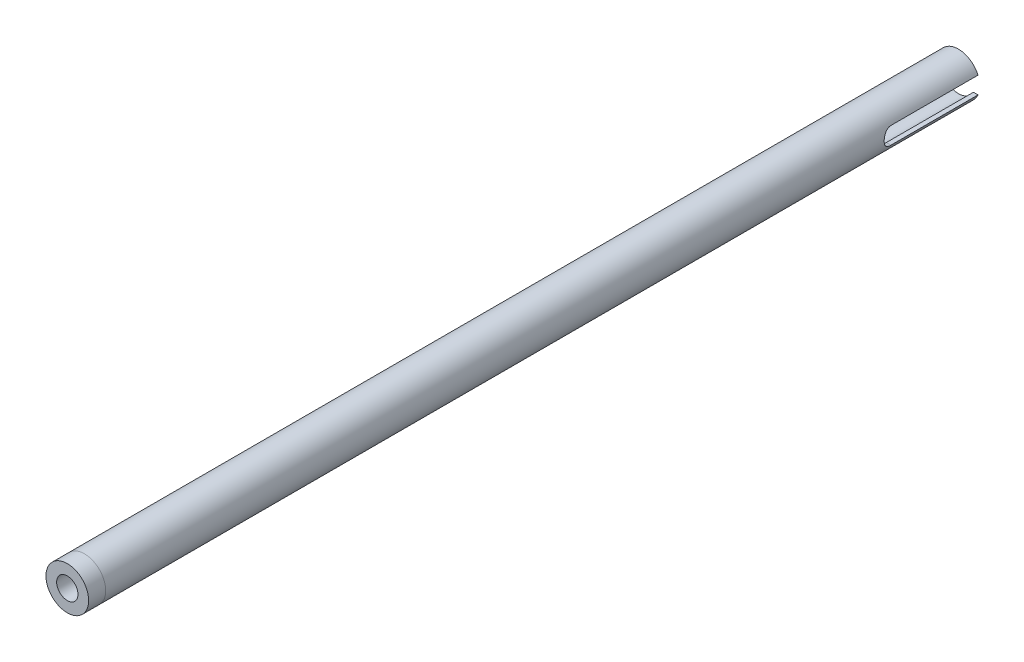
ISO-10303-21;
HEADER;
FILE_DESCRIPTION(('STEP AP214'),'2;1');
FILE_NAME('part.step','',(''),(''),'','','');
FILE_SCHEMA(('AUTOMOTIVE_DESIGN { 1 0 10303 214 1 1 1 1 }'));
ENDSEC;
DATA;
#1=APPLICATION_CONTEXT('core data for automotive mechanical design processes');
#2=APPLICATION_PROTOCOL_DEFINITION('international standard','automotive_design',2000,#1);
#3=PRODUCT_CONTEXT('',#1,'mechanical');
#4=PRODUCT('Part','Part','',(#3));
#5=PRODUCT_RELATED_PRODUCT_CATEGORY('part','',(#4));
#6=PRODUCT_DEFINITION_FORMATION('','',#4);
#7=PRODUCT_DEFINITION_CONTEXT('part definition',#1,'design');
#8=PRODUCT_DEFINITION('design','',#6,#7);
#9=PRODUCT_DEFINITION_SHAPE('','',#8);
#10=(LENGTH_UNIT() NAMED_UNIT(*) SI_UNIT(.MILLI.,.METRE.));
#11=(NAMED_UNIT(*) PLANE_ANGLE_UNIT() SI_UNIT($,.RADIAN.));
#12=(NAMED_UNIT(*) SI_UNIT($,.STERADIAN.) SOLID_ANGLE_UNIT());
#13=UNCERTAINTY_MEASURE_WITH_UNIT(LENGTH_MEASURE(1.E-05),#10,'distance_accuracy_value','');
#14=(GEOMETRIC_REPRESENTATION_CONTEXT(3) GLOBAL_UNCERTAINTY_ASSIGNED_CONTEXT((#13)) GLOBAL_UNIT_ASSIGNED_CONTEXT((#10,
#11,#12)) REPRESENTATION_CONTEXT('',''));
#15=CARTESIAN_POINT('',(0.,0.,0.));
#16=DIRECTION('',(0.,0.,1.));
#17=DIRECTION('',(1.,0.,0.));
#18=AXIS2_PLACEMENT_3D('',#15,#16,#17);
#19=CARTESIAN_POINT('',(0.,0.,-331.464013661692));
#20=DIRECTION('',(0.,0.,1.));
#21=DIRECTION('',(1.,0.,0.));
#22=AXIS2_PLACEMENT_3D('',#19,#20,#21);
#23=CYLINDRICAL_SURFACE('',#22,7.9375);
#24=CARTESIAN_POINT('',(0.,0.,-6.35));
#25=DIRECTION('',(0.,0.,1.));
#26=DIRECTION('',(1.,0.,0.));
#27=AXIS2_PLACEMENT_3D('',#24,#25,#26);
#28=CIRCLE('',#27,7.9375);
#29=CARTESIAN_POINT('',(7.9375,0.,-6.35));
#30=VERTEX_POINT('',#29);
#31=EDGE_CURVE('E167',#30,#30,#28,.T.);
#32=ORIENTED_EDGE('',*,*,#31,.F.);
#33=EDGE_LOOP('',(#32));
#34=FACE_BOUND('',#33,.T.);
#35=CARTESIAN_POINT('',(-7.2748389157424,3.175,-299.079013661692));
#36=CARTESIAN_POINT('',(-7.27482137043434,3.17501267173453,-298.99359354621));
#37=CARTESIAN_POINT('',(-7.27634297592672,3.17155313247793,-298.908183016647));
#38=CARTESIAN_POINT('',(-7.28233338484875,3.15778866907725,-298.738051012319));
#39=CARTESIAN_POINT('',(-7.28680106535325,3.14748635311323,-298.65332928746));
#40=CARTESIAN_POINT('',(-7.29852916312671,3.12019002880162,-298.485515587651));
#41=CARTESIAN_POINT('',(-7.30577831906487,3.10322299732751,-298.402418442892));
#42=CARTESIAN_POINT('',(-7.32282161153745,3.06278779397034,-298.238107340867));
#43=CARTESIAN_POINT('',(-7.33261590324725,3.03931922568674,-298.156893498753));
#44=CARTESIAN_POINT('',(-7.36535331460444,2.95952924342962,-297.917068676171));
#45=CARTESIAN_POINT('',(-7.39167595677839,2.89376893609239,-297.761943747367));
#46=CARTESIAN_POINT('',(-7.45033259991547,2.73920602658923,-297.464856320656));
#47=CARTESIAN_POINT('',(-7.48267254395243,2.65038060922872,-297.322907045438));
#48=CARTESIAN_POINT('',(-7.55175295441386,2.44684429809695,-297.048186275918));
#49=CARTESIAN_POINT('',(-7.58863404630154,2.33103943595689,-296.916258891406));
#50=CARTESIAN_POINT('',(-7.66147718953598,2.07914562663536,-296.673096007774));
#51=CARTESIAN_POINT('',(-7.69743902899202,1.94305205135848,-296.561865242847));
#52=CARTESIAN_POINT('',(-7.76611692840651,1.6477828266442,-296.358944043351));
#53=CARTESIAN_POINT('',(-7.79864638434712,1.48790317306357,-296.268209631947));
#54=CARTESIAN_POINT('',(-7.85502980346525,1.15369615984565,-296.11535207853));
#55=CARTESIAN_POINT('',(-7.87889360585224,0.979385463602728,-296.053196465912));
#56=CARTESIAN_POINT('',(-7.91022225039827,0.670405323433351,-295.972684822257));
#57=CARTESIAN_POINT('',(-7.92038443902171,0.537888188660434,-295.947006898847));
#58=CARTESIAN_POINT('',(-7.93061686811603,0.337231082382101,-295.921251815766));
#59=CARTESIAN_POINT('',(-7.93319257341971,0.269991647180293,-295.914793718485));
#60=CARTESIAN_POINT('',(-7.93663621925193,0.135173873369594,-295.906172700733));
#61=CARTESIAN_POINT('',(-7.93750363389236,0.0675954368175856,-295.904011102915));
#62=CARTESIAN_POINT('',(-7.9375,0.,-295.904013661692));
#63=B_SPLINE_CURVE_WITH_KNOTS('',3,(#35,#36,#37,#38,#39,#40,#41,#42,#43,#44,#45,#46,#47,#48,#49,
#50,#51,#52,#53,#54,#55,#56,#57,#58,#59,#60,#61,#62),.UNSPECIFIED.,.F.,.F.,(4,2,2,2,2,2,2,2,2,2,
2,2,2,4),(0.,0.256160797396612,0.512224013007114,0.767261264672295,1.02231406945471,
1.53142416248594,2.04103978047897,2.57679273649398,3.11266809162683,3.6699113602974,
4.22651992730645,4.63134321412667,4.8339937586662,5.03670667834028),.UNSPECIFIED.);
#64=CARTESIAN_POINT('',(-7.2748389157424,3.175,-299.079013661692));
#65=VERTEX_POINT('',#64);
#66=CARTESIAN_POINT('',(-7.9375,0.,-295.904013661692));
#67=VERTEX_POINT('',#66);
#68=EDGE_CURVE('E194',#65,#67,#63,.T.);
#69=ORIENTED_EDGE('',*,*,#68,.T.);
#70=CARTESIAN_POINT('',(-7.9375,0.,-295.904013661692));
#71=CARTESIAN_POINT('',(-7.93751279435796,-0.0856973243893202,-295.904001631523));
#72=CARTESIAN_POINT('',(-7.93611246860092,-0.171386675169295,-295.907482998995));
#73=CARTESIAN_POINT('',(-7.93058107051394,-0.342092796869091,-295.92133909433));
#74=CARTESIAN_POINT('',(-7.92645080745519,-0.427109759557719,-295.931711779313));
#75=CARTESIAN_POINT('',(-7.91557399086504,-0.595570690948314,-295.95920897338));
#76=CARTESIAN_POINT('',(-7.90883664469869,-0.679019123580001,-295.976309724654));
#77=CARTESIAN_POINT('',(-7.89293284658536,-0.844038966454637,-296.017076972127));
#78=CARTESIAN_POINT('',(-7.88376629739099,-0.925610301410299,-296.040743731184));
#79=CARTESIAN_POINT('',(-7.8529700783248,-1.16656173687588,-296.121251386882));
#80=CARTESIAN_POINT('',(-7.82802544143957,-1.3224472028299,-296.187644019759));
#81=CARTESIAN_POINT('',(-7.77174407779742,-1.62081902572889,-296.343689423752));
#82=CARTESIAN_POINT('',(-7.74040257287306,-1.76329524966531,-296.433359595815));
#83=CARTESIAN_POINT('',(-7.67287736621953,-2.03755465224644,-296.637813203331));
#84=CARTESIAN_POINT('',(-7.63654472176442,-2.16862853615059,-296.753500060062));
#85=CARTESIAN_POINT('',(-7.56380976030912,-2.4101102261282,-297.004794161771));
#86=CARTESIAN_POINT('',(-7.52740741976911,-2.52050895891189,-297.140410106254));
#87=CARTESIAN_POINT('',(-7.45683282624283,-2.72240939900243,-297.43510860112));
#88=CARTESIAN_POINT('',(-7.4228346735038,-2.81283701743191,-297.594972591035));
#89=CARTESIAN_POINT('',(-7.36333622196319,-2.96511894168389,-297.929098555832));
#90=CARTESIAN_POINT('',(-7.33782422493328,-3.02701262758154,-298.103340293591));
#91=CARTESIAN_POINT('',(-7.30424985403508,-3.10695047193342,-298.411644018242));
#92=CARTESIAN_POINT('',(-7.29331360019113,-3.13238569878909,-298.543502779128));
#93=CARTESIAN_POINT('',(-7.28227977674291,-3.15790858319001,-298.743219660822));
#94=CARTESIAN_POINT('',(-7.27949685702346,-3.16431127275807,-298.810167951582));
#95=CARTESIAN_POINT('',(-7.27577355567174,-3.17285909036155,-298.944409509448));
#96=CARTESIAN_POINT('',(-7.27483380475762,-3.1750027609968,-299.011702886746));
#97=CARTESIAN_POINT('',(-7.2748389157424,-3.175,-299.079013661692));
#98=B_SPLINE_CURVE_WITH_KNOTS('',3,(#70,#71,#72,#73,#74,#75,#76,#77,#78,#79,#80,#81,#82,#83,#84,
#85,#86,#87,#88,#89,#90,#91,#92,#93,#94,#95,#96,#97),.UNSPECIFIED.,.F.,.F.,(4,2,2,2,2,2,2,2,2,2,
2,2,2,4),(0.,0.256996432008012,0.513916713336978,0.769937797705373,1.02596913282157,
1.53722547809955,2.04886511530059,2.58219314099272,3.11575467201799,3.67332953074268,
4.2301325519037,4.63306130520182,4.83485003827446,5.03670780985613),.UNSPECIFIED.);
#99=CARTESIAN_POINT('',(-7.2748389157424,-3.175,-299.079013661692));
#100=VERTEX_POINT('',#99);
#101=EDGE_CURVE('E146',#67,#100,#98,.T.);
#102=ORIENTED_EDGE('',*,*,#101,.T.);
#103=DIRECTION('',(0.,0.,-1.));
#104=VECTOR('',#103,1.);
#105=CARTESIAN_POINT('',(-7.2748389157424,-3.175,-295.904013661692));
#106=LINE('',#105,#104);
#107=CARTESIAN_POINT('',(-7.2748389157424,-3.175,-331.464013661692));
#108=VERTEX_POINT('',#107);
#109=EDGE_CURVE('E141',#100,#108,#106,.T.);
#110=ORIENTED_EDGE('',*,*,#109,.T.);
#111=CARTESIAN_POINT('',(0.,0.,-331.464013661692));
#112=DIRECTION('',(0.,0.,1.));
#113=DIRECTION('',(1.,0.,0.));
#114=AXIS2_PLACEMENT_3D('',#111,#112,#113);
#115=CIRCLE('',#114,7.9375);
#116=CARTESIAN_POINT('',(7.2748389157424,-3.175,-331.464013661692));
#117=VERTEX_POINT('',#116);
#118=EDGE_CURVE('E144',#108,#117,#115,.T.);
#119=ORIENTED_EDGE('',*,*,#118,.T.);
#120=DIRECTION('',(0.,0.,-1.));
#121=VECTOR('',#120,1.);
#122=CARTESIAN_POINT('',(7.2748389157424,-3.175,-295.904013661692));
#123=LINE('',#122,#121);
#124=CARTESIAN_POINT('',(7.2748389157424,-3.175,-299.079013661692));
#125=VERTEX_POINT('',#124);
#126=EDGE_CURVE('E427',#125,#117,#123,.T.);
#127=ORIENTED_EDGE('',*,*,#126,.F.);
#128=CARTESIAN_POINT('',(7.2748389157424,-3.175,-299.079013661692));
#129=CARTESIAN_POINT('',(7.27482137043434,-3.17501267173453,-298.99359354621));
#130=CARTESIAN_POINT('',(7.27634297592672,-3.17155313247793,-298.908183016647));
#131=CARTESIAN_POINT('',(7.28233338484875,-3.15778866907725,-298.738051012319));
#132=CARTESIAN_POINT('',(7.28680106535325,-3.14748635311323,-298.65332928746));
#133=CARTESIAN_POINT('',(7.29852916312671,-3.12019002880162,-298.485515587651));
#134=CARTESIAN_POINT('',(7.30577831906487,-3.10322299732751,-298.402418442892));
#135=CARTESIAN_POINT('',(7.32282161153745,-3.06278779397034,-298.238107340867));
#136=CARTESIAN_POINT('',(7.33261590324725,-3.03931922568674,-298.156893498753));
#137=CARTESIAN_POINT('',(7.36535331460444,-2.95952924342962,-297.917068676171));
#138=CARTESIAN_POINT('',(7.39167595677839,-2.89376893609239,-297.761943747367));
#139=CARTESIAN_POINT('',(7.45033259991547,-2.73920602658923,-297.464856320656));
#140=CARTESIAN_POINT('',(7.48267254395243,-2.65038060922872,-297.322907045438));
#141=CARTESIAN_POINT('',(7.55175295441386,-2.44684429809695,-297.048186275918));
#142=CARTESIAN_POINT('',(7.58863404630154,-2.33103943595689,-296.916258891406));
#143=CARTESIAN_POINT('',(7.66147718953598,-2.07914562663536,-296.673096007774));
#144=CARTESIAN_POINT('',(7.69743902899202,-1.94305205135848,-296.561865242847));
#145=CARTESIAN_POINT('',(7.76611692840651,-1.6477828266442,-296.358944043351));
#146=CARTESIAN_POINT('',(7.79864638434712,-1.48790317306357,-296.268209631947));
#147=CARTESIAN_POINT('',(7.85502980346525,-1.15369615984565,-296.11535207853));
#148=CARTESIAN_POINT('',(7.87889360585224,-0.979385463602728,-296.053196465912));
#149=CARTESIAN_POINT('',(7.91022225039827,-0.670405323433351,-295.972684822257));
#150=CARTESIAN_POINT('',(7.92038443902171,-0.537888188660434,-295.947006898847));
#151=CARTESIAN_POINT('',(7.93061686811603,-0.337231082382101,-295.921251815766));
#152=CARTESIAN_POINT('',(7.93319257341971,-0.269991647180293,-295.914793718485));
#153=CARTESIAN_POINT('',(7.93663621925193,-0.135173873369594,-295.906172700733));
#154=CARTESIAN_POINT('',(7.93750363389236,-0.0675954368175856,-295.904011102915));
#155=CARTESIAN_POINT('',(7.9375,0.,-295.904013661692));
#156=B_SPLINE_CURVE_WITH_KNOTS('',3,(#128,#129,#130,#131,#132,#133,#134,#135,#136,#137,#138,
#139,#140,#141,#142,#143,#144,#145,#146,#147,#148,#149,#150,#151,#152,#153,#154,#155),
.UNSPECIFIED.,.F.,.F.,(4,2,2,2,2,2,2,2,2,2,2,2,2,4),(0.,0.256160797396612,0.512224013007114,
0.767261264672295,1.02231406945471,1.53142416248594,2.04103978047897,2.57679273649398,
3.11266809162683,3.6699113602974,4.22651992730645,4.63134321412667,4.8339937586662,
5.03670667834028),.UNSPECIFIED.);
#157=CARTESIAN_POINT('',(7.9375,0.,-295.904013661692));
#158=VERTEX_POINT('',#157);
#159=EDGE_CURVE('E87',#125,#158,#156,.T.);
#160=ORIENTED_EDGE('',*,*,#159,.T.);
#161=CARTESIAN_POINT('',(7.9375,0.,-295.904013661692));
#162=CARTESIAN_POINT('',(7.93751279435796,0.0856973243893202,-295.904001631523));
#163=CARTESIAN_POINT('',(7.93611246860092,0.171386675169295,-295.907482998995));
#164=CARTESIAN_POINT('',(7.93058107051394,0.342092796869091,-295.92133909433));
#165=CARTESIAN_POINT('',(7.92645080745519,0.427109759557719,-295.931711779313));
#166=CARTESIAN_POINT('',(7.91557399086504,0.595570690948314,-295.95920897338));
#167=CARTESIAN_POINT('',(7.90883664469869,0.679019123580001,-295.976309724654));
#168=CARTESIAN_POINT('',(7.89293284658536,0.844038966454637,-296.017076972127));
#169=CARTESIAN_POINT('',(7.88376629739099,0.925610301410299,-296.040743731184));
#170=CARTESIAN_POINT('',(7.8529700783248,1.16656173687588,-296.121251386882));
#171=CARTESIAN_POINT('',(7.82802544143957,1.3224472028299,-296.187644019759));
#172=CARTESIAN_POINT('',(7.77174407779742,1.62081902572889,-296.343689423752));
#173=CARTESIAN_POINT('',(7.74040257287306,1.76329524966531,-296.433359595815));
#174=CARTESIAN_POINT('',(7.67287736621953,2.03755465224644,-296.637813203331));
#175=CARTESIAN_POINT('',(7.63654472176442,2.16862853615059,-296.753500060062));
#176=CARTESIAN_POINT('',(7.56380976030912,2.4101102261282,-297.004794161771));
#177=CARTESIAN_POINT('',(7.52740741976911,2.52050895891189,-297.140410106254));
#178=CARTESIAN_POINT('',(7.45683282624283,2.72240939900243,-297.43510860112));
#179=CARTESIAN_POINT('',(7.4228346735038,2.81283701743191,-297.594972591035));
#180=CARTESIAN_POINT('',(7.36333622196319,2.96511894168389,-297.929098555832));
#181=CARTESIAN_POINT('',(7.33782422493328,3.02701262758154,-298.103340293591));
#182=CARTESIAN_POINT('',(7.30424985403508,3.10695047193342,-298.411644018242));
#183=CARTESIAN_POINT('',(7.29331360019113,3.13238569878909,-298.543502779128));
#184=CARTESIAN_POINT('',(7.28227977674291,3.15790858319001,-298.743219660822));
#185=CARTESIAN_POINT('',(7.27949685702346,3.16431127275807,-298.810167951582));
#186=CARTESIAN_POINT('',(7.27577355567174,3.17285909036155,-298.944409509448));
#187=CARTESIAN_POINT('',(7.27483380475762,3.1750027609968,-299.011702886746));
#188=CARTESIAN_POINT('',(7.2748389157424,3.175,-299.079013661692));
#189=B_SPLINE_CURVE_WITH_KNOTS('',3,(#161,#162,#163,#164,#165,#166,#167,#168,#169,#170,#171,
#172,#173,#174,#175,#176,#177,#178,#179,#180,#181,#182,#183,#184,#185,#186,#187,#188),
.UNSPECIFIED.,.F.,.F.,(4,2,2,2,2,2,2,2,2,2,2,2,2,4),(0.,0.256996432008012,0.513916713336978,
0.769937797705373,1.02596913282157,1.53722547809955,2.04886511530059,2.58219314099272,
3.11575467201799,3.67332953074268,4.2301325519037,4.63306130520182,4.83485003827446,
5.03670780985613),.UNSPECIFIED.);
#190=CARTESIAN_POINT('',(7.2748389157424,3.175,-299.079013661692));
#191=VERTEX_POINT('',#190);
#192=EDGE_CURVE('E73',#158,#191,#189,.T.);
#193=ORIENTED_EDGE('',*,*,#192,.T.);
#194=DIRECTION('',(0.,0.,-1.));
#195=VECTOR('',#194,1.);
#196=CARTESIAN_POINT('',(7.2748389157424,3.175,-295.904013661692));
#197=LINE('',#196,#195);
#198=CARTESIAN_POINT('',(7.2748389157424,3.175,-331.464013661692));
#199=VERTEX_POINT('',#198);
#200=EDGE_CURVE('E160',#191,#199,#197,.T.);
#201=ORIENTED_EDGE('',*,*,#200,.T.);
#202=CARTESIAN_POINT('',(-7.2748389157424,3.175,-331.464013661692));
#203=VERTEX_POINT('',#202);
#204=EDGE_CURVE('E166',#199,#203,#115,.T.);
#205=ORIENTED_EDGE('',*,*,#204,.T.);
#206=DIRECTION('',(0.,0.,-1.));
#207=VECTOR('',#206,1.);
#208=CARTESIAN_POINT('',(-7.2748389157424,3.175,-295.904013661692));
#209=LINE('',#208,#207);
#210=EDGE_CURVE('E420',#65,#203,#209,.T.);
#211=ORIENTED_EDGE('',*,*,#210,.F.);
#212=EDGE_LOOP('',(#69,#102,#110,#119,#127,#160,#193,#201,#205,#211));
#213=FACE_BOUND('',#212,.T.);
#214=ADVANCED_FACE('F63',(#34,#213),#23,.T.);
#215=CARTESIAN_POINT('',(0.,0.,-331.464013661692));
#216=DIRECTION('',(0.,0.,1.));
#217=DIRECTION('',(1.,0.,0.));
#218=AXIS2_PLACEMENT_3D('',#215,#216,#217);
#219=PLANE('',#218);
#220=DIRECTION('',(1.,0.,0.));
#221=VECTOR('',#220,1.);
#222=CARTESIAN_POINT('',(0.,-3.175,-331.464013661692));
#223=LINE('',#222,#221);
#224=CARTESIAN_POINT('',(-5.57246419907746,-3.175,-331.464013661692));
#225=VERTEX_POINT('',#224);
#226=EDGE_CURVE('E153',#108,#225,#223,.T.);
#227=ORIENTED_EDGE('',*,*,#226,.T.);
#228=CARTESIAN_POINT('',(0.,0.,-331.464013661692));
#229=DIRECTION('',(0.,0.,1.));
#230=DIRECTION('',(1.,0.,0.));
#231=AXIS2_PLACEMENT_3D('',#228,#229,#230);
#232=CIRCLE('',#231,6.4135);
#233=CARTESIAN_POINT('',(5.57246419907746,-3.175,-331.464013661692));
#234=VERTEX_POINT('',#233);
#235=EDGE_CURVE('E275',#225,#234,#232,.T.);
#236=ORIENTED_EDGE('',*,*,#235,.T.);
#237=DIRECTION('',(1.,0.,0.));
#238=VECTOR('',#237,1.);
#239=CARTESIAN_POINT('',(0.,-3.175,-331.464013661692));
#240=LINE('',#239,#238);
#241=EDGE_CURVE('E165',#234,#117,#240,.T.);
#242=ORIENTED_EDGE('',*,*,#241,.T.);
#243=ORIENTED_EDGE('',*,*,#118,.F.);
#244=EDGE_LOOP('',(#227,#236,#242,#243));
#245=FACE_BOUND('',#244,.T.);
#246=ADVANCED_FACE('F163',(#245),#219,.F.);
#247=CARTESIAN_POINT('',(0.,0.,-331.464013661692));
#248=DIRECTION('',(0.,0.,1.));
#249=DIRECTION('',(1.,0.,0.));
#250=AXIS2_PLACEMENT_3D('',#247,#248,#249);
#251=CYLINDRICAL_SURFACE('',#250,6.4135);
#252=CARTESIAN_POINT('',(0.,0.,-6.35));
#253=DIRECTION('',(0.,0.,1.));
#254=DIRECTION('',(1.,0.,0.));
#255=AXIS2_PLACEMENT_3D('',#252,#253,#254);
#256=CIRCLE('',#255,6.4135);
#257=CARTESIAN_POINT('',(6.4135,0.,-6.35));
#258=VERTEX_POINT('',#257);
#259=EDGE_CURVE('E149',#258,#258,#256,.T.);
#260=ORIENTED_EDGE('',*,*,#259,.T.);
#261=EDGE_LOOP('',(#260));
#262=FACE_BOUND('',#261,.T.);
#263=DIRECTION('',(0.,0.,-1.));
#264=VECTOR('',#263,1.);
#265=CARTESIAN_POINT('',(-5.57246419907746,-3.175,-295.904013661692));
#266=LINE('',#265,#264);
#267=CARTESIAN_POINT('',(-5.57246419907746,-3.175,-299.079013661692));
#268=VERTEX_POINT('',#267);
#269=EDGE_CURVE('E150',#268,#225,#266,.T.);
#270=ORIENTED_EDGE('',*,*,#269,.F.);
#271=CARTESIAN_POINT('',(-5.57246419907746,-3.175,-299.079013661692));
#272=CARTESIAN_POINT('',(-5.57244013006406,-3.17501485930532,-298.995734548654));
#273=CARTESIAN_POINT('',(-5.57433046393327,-3.17172393593588,-298.912468781783));
#274=CARTESIAN_POINT('',(-5.58175879139227,-3.1586474174694,-298.746661196971));
#275=CARTESIAN_POINT('',(-5.58729459414878,-3.14886572313218,-298.66411897437));
#276=CARTESIAN_POINT('',(-5.60179156831921,-3.12299843383606,-298.500822167641));
#277=CARTESIAN_POINT('',(-5.61073298145,-3.10694918790096,-298.420060062727));
#278=CARTESIAN_POINT('',(-5.63171276239417,-3.06875665913499,-298.260416147227));
#279=CARTESIAN_POINT('',(-5.64375147558632,-3.04661269666535,-298.181534547406));
#280=CARTESIAN_POINT('',(-5.6838799338154,-2.97148657354665,-297.948801372408));
#281=CARTESIAN_POINT('',(-5.71602843451585,-2.9097324304215,-297.798380875169));
#282=CARTESIAN_POINT('',(-5.78746445334562,-2.76491119647659,-297.509923658341));
#283=CARTESIAN_POINT('',(-5.82676307252431,-2.68181088046088,-297.371906700975));
#284=CARTESIAN_POINT('',(-5.91189137020974,-2.48887418737119,-297.100109616947));
#285=CARTESIAN_POINT('',(-5.95799203211626,-2.37743022169017,-296.967552814495));
#286=CARTESIAN_POINT('',(-6.04933625068998,-2.1343317962695,-296.722085145423));
#287=CARTESIAN_POINT('',(-6.09457954365871,-2.00267122837298,-296.60918023841));
#288=CARTESIAN_POINT('',(-6.18270630442022,-1.71220053093684,-296.398860945958));
#289=CARTESIAN_POINT('',(-6.22523407848511,-1.55216870534977,-296.302971195526));
#290=CARTESIAN_POINT('',(-6.29953728626817,-1.21586879246633,-296.140122299209));
#291=CARTESIAN_POINT('',(-6.33132906884324,-1.03962591706377,-296.073119121166));
#292=CARTESIAN_POINT('',(-6.37455801221378,-0.719418942476251,-295.983247288836));
#293=CARTESIAN_POINT('',(-6.38903678436651,-0.577736145507957,-295.953674574471));
#294=CARTESIAN_POINT('',(-6.40364692368403,-0.362616983152035,-295.923953500157));
#295=CARTESIAN_POINT('',(-6.40733246196224,-0.290370591494077,-295.916485987519));
#296=CARTESIAN_POINT('',(-6.41226237468065,-0.145424356491906,-295.906513098581));
#297=CARTESIAN_POINT('',(-6.41350576158006,-0.072724341630371,-295.904009729644));
#298=CARTESIAN_POINT('',(-6.4135,0.,-295.904013661692));
#299=B_SPLINE_CURVE_WITH_KNOTS('',3,(#271,#272,#273,#274,#275,#276,#277,#278,#279,#280,#281,
#282,#283,#284,#285,#286,#287,#288,#289,#290,#291,#292,#293,#294,#295,#296,#297,#298),
.UNSPECIFIED.,.F.,.F.,(4,2,2,2,2,2,2,2,2,2,2,2,2,4),(0.,0.249729002226553,0.499308060527526,
0.747460667546715,0.995640957972498,1.49055300136661,1.98624009021394,2.52160227908796,
3.05712653941521,3.62817923327589,4.19835836008502,4.63305000595099,4.85103401853339,
5.06910615989469),.UNSPECIFIED.);
#300=CARTESIAN_POINT('',(-6.4135,0.,-295.904013661692));
#301=VERTEX_POINT('',#300);
#302=EDGE_CURVE('E221',#268,#301,#299,.T.);
#303=ORIENTED_EDGE('',*,*,#302,.T.);
#304=CARTESIAN_POINT('',(-6.4135,0.,-295.904013661692));
#305=CARTESIAN_POINT('',(-6.41351478956106,0.0839162873638173,-295.904000261796));
#306=CARTESIAN_POINT('',(-6.41185341043851,0.167823114288178,-295.907340187843));
#307=CARTESIAN_POINT('',(-6.40528923860734,0.334952536326365,-295.920622628448));
#308=CARTESIAN_POINT('',(-6.40038773102953,0.41817538948009,-295.930562525269));
#309=CARTESIAN_POINT('',(-6.38748331817869,0.582965498785221,-295.956881329787));
#310=CARTESIAN_POINT('',(-6.37949454331383,0.664538541389254,-295.973230905275));
#311=CARTESIAN_POINT('',(-6.36062930478242,0.82582159525237,-296.012169208868));
#312=CARTESIAN_POINT('',(-6.34975266552956,0.905531492908813,-296.034758316349));
#313=CARTESIAN_POINT('',(-6.31319792977547,1.14087800407252,-296.111494879109));
#314=CARTESIAN_POINT('',(-6.28356695572383,1.29306927815055,-296.174666527297));
#315=CARTESIAN_POINT('',(-6.21648032622801,1.58455945770354,-296.322817269277));
#316=CARTESIAN_POINT('',(-6.17901685649498,1.72384528592309,-296.407818161057));
#317=CARTESIAN_POINT('',(-6.09713913910647,1.99475482128857,-296.602918299308));
#318=CARTESIAN_POINT('',(-6.05244508581476,2.12544046453043,-296.714203176046));
#319=CARTESIAN_POINT('',(-5.96206469267669,2.36716277188881,-296.956172622211));
#320=CARTESIAN_POINT('',(-5.9163776032387,2.47818397002904,-297.086872314051));
#321=CARTESIAN_POINT('',(-5.82517699615972,2.68591268931947,-297.375918143003));
#322=CARTESIAN_POINT('',(-5.77994318763785,2.78087960507693,-297.535613337583));
#323=CARTESIAN_POINT('',(-5.69959190124919,2.94207442790849,-297.870996614765));
#324=CARTESIAN_POINT('',(-5.66445328320705,3.00836254036259,-298.046650247937));
#325=CARTESIAN_POINT('',(-5.61637168534322,3.09697219420916,-298.36510162233));
#326=CARTESIAN_POINT('',(-5.60011055849822,3.12606223436071,-298.50551622499));
#327=CARTESIAN_POINT('',(-5.58363385282995,3.15533369889113,-298.718893103233));
#328=CARTESIAN_POINT('',(-5.57946041232981,3.16269716900746,-298.790624828114));
#329=CARTESIAN_POINT('',(-5.57386984218861,3.17253394278506,-298.934566768157));
#330=CARTESIAN_POINT('',(-5.57245416126573,3.17500467618403,-299.006777214828));
#331=CARTESIAN_POINT('',(-5.57246419907746,3.175,-299.079013661692));
#332=B_SPLINE_CURVE_WITH_KNOTS('',3,(#304,#305,#306,#307,#308,#309,#310,#311,#312,#313,#314,
#315,#316,#317,#318,#319,#320,#321,#322,#323,#324,#325,#326,#327,#328,#329,#330,#331),
.UNSPECIFIED.,.F.,.F.,(4,2,2,2,2,2,2,2,2,2,2,2,2,4),(0.,0.251650249697321,0.503200747298848,
0.753613280993143,1.00404104361821,1.50387930503277,2.00421864304452,2.53410176460236,
3.06439980342595,3.63519589642623,4.20478783377489,4.63602373673199,4.85251353275909,
5.06911702550462),.UNSPECIFIED.);
#333=CARTESIAN_POINT('',(-5.57246419907746,3.175,-299.079013661692));
#334=VERTEX_POINT('',#333);
#335=EDGE_CURVE('E186',#301,#334,#332,.T.);
#336=ORIENTED_EDGE('',*,*,#335,.T.);
#337=DIRECTION('',(0.,0.,-1.));
#338=VECTOR('',#337,1.);
#339=CARTESIAN_POINT('',(-5.57246419907746,3.175,-295.904013661692));
#340=LINE('',#339,#338);
#341=CARTESIAN_POINT('',(-5.57246419907746,3.175,-331.464013661692));
#342=VERTEX_POINT('',#341);
#343=EDGE_CURVE('E417',#334,#342,#340,.T.);
#344=ORIENTED_EDGE('',*,*,#343,.T.);
#345=CARTESIAN_POINT('',(5.57246419907746,3.175,-331.464013661692));
#346=VERTEX_POINT('',#345);
#347=EDGE_CURVE('E172',#346,#342,#232,.T.);
#348=ORIENTED_EDGE('',*,*,#347,.F.);
#349=DIRECTION('',(0.,0.,-1.));
#350=VECTOR('',#349,1.);
#351=CARTESIAN_POINT('',(5.57246419907746,3.175,-295.904013661692));
#352=LINE('',#351,#350);
#353=CARTESIAN_POINT('',(5.57246419907746,3.175,-299.079013661692));
#354=VERTEX_POINT('',#353);
#355=EDGE_CURVE('E269',#354,#346,#352,.T.);
#356=ORIENTED_EDGE('',*,*,#355,.F.);
#357=CARTESIAN_POINT('',(5.57246419907746,3.175,-299.079013661692));
#358=CARTESIAN_POINT('',(5.57244013006406,3.17501485930532,-298.995734548654));
#359=CARTESIAN_POINT('',(5.57433046393327,3.17172393593588,-298.912468781783));
#360=CARTESIAN_POINT('',(5.58175879139227,3.1586474174694,-298.746661196971));
#361=CARTESIAN_POINT('',(5.58729459414878,3.14886572313218,-298.66411897437));
#362=CARTESIAN_POINT('',(5.60179156831921,3.12299843383606,-298.500822167641));
#363=CARTESIAN_POINT('',(5.61073298145,3.10694918790096,-298.420060062727));
#364=CARTESIAN_POINT('',(5.63171276239417,3.06875665913499,-298.260416147227));
#365=CARTESIAN_POINT('',(5.64375147558632,3.04661269666535,-298.181534547406));
#366=CARTESIAN_POINT('',(5.6838799338154,2.97148657354665,-297.948801372408));
#367=CARTESIAN_POINT('',(5.71602843451585,2.9097324304215,-297.798380875169));
#368=CARTESIAN_POINT('',(5.78746445334562,2.76491119647659,-297.509923658341));
#369=CARTESIAN_POINT('',(5.82676307252431,2.68181088046088,-297.371906700975));
#370=CARTESIAN_POINT('',(5.91189137020974,2.48887418737119,-297.100109616947));
#371=CARTESIAN_POINT('',(5.95799203211626,2.37743022169017,-296.967552814495));
#372=CARTESIAN_POINT('',(6.04933625068998,2.1343317962695,-296.722085145423));
#373=CARTESIAN_POINT('',(6.09457954365871,2.00267122837298,-296.60918023841));
#374=CARTESIAN_POINT('',(6.18270630442022,1.71220053093684,-296.398860945958));
#375=CARTESIAN_POINT('',(6.22523407848511,1.55216870534977,-296.302971195526));
#376=CARTESIAN_POINT('',(6.29953728626817,1.21586879246633,-296.140122299209));
#377=CARTESIAN_POINT('',(6.33132906884324,1.03962591706377,-296.073119121166));
#378=CARTESIAN_POINT('',(6.37455801221378,0.719418942476251,-295.983247288836));
#379=CARTESIAN_POINT('',(6.38903678436651,0.577736145507957,-295.953674574471));
#380=CARTESIAN_POINT('',(6.40364692368403,0.362616983152035,-295.923953500157));
#381=CARTESIAN_POINT('',(6.40733246196224,0.290370591494077,-295.916485987519));
#382=CARTESIAN_POINT('',(6.41226237468065,0.145424356491906,-295.906513098581));
#383=CARTESIAN_POINT('',(6.41350576158006,0.072724341630371,-295.904009729644));
#384=CARTESIAN_POINT('',(6.4135,0.,-295.904013661692));
#385=B_SPLINE_CURVE_WITH_KNOTS('',3,(#357,#358,#359,#360,#361,#362,#363,#364,#365,#366,#367,
#368,#369,#370,#371,#372,#373,#374,#375,#376,#377,#378,#379,#380,#381,#382,#383,#384),
.UNSPECIFIED.,.F.,.F.,(4,2,2,2,2,2,2,2,2,2,2,2,2,4),(0.,0.249729002226553,0.499308060527526,
0.747460667546715,0.995640957972498,1.49055300136661,1.98624009021394,2.52160227908796,
3.05712653941521,3.62817923327589,4.19835836008502,4.63305000595099,4.85103401853339,
5.06910615989469),.UNSPECIFIED.);
#386=CARTESIAN_POINT('',(6.4135,0.,-295.904013661692));
#387=VERTEX_POINT('',#386);
#388=EDGE_CURVE('E13',#354,#387,#385,.T.);
#389=ORIENTED_EDGE('',*,*,#388,.T.);
#390=CARTESIAN_POINT('',(6.4135,0.,-295.904013661692));
#391=CARTESIAN_POINT('',(6.41351478956106,-0.0839162873638173,-295.904000261796));
#392=CARTESIAN_POINT('',(6.41185341043851,-0.167823114288178,-295.907340187843));
#393=CARTESIAN_POINT('',(6.40528923860734,-0.334952536326365,-295.920622628448));
#394=CARTESIAN_POINT('',(6.40038773102953,-0.41817538948009,-295.930562525269));
#395=CARTESIAN_POINT('',(6.38748331817869,-0.582965498785221,-295.956881329787));
#396=CARTESIAN_POINT('',(6.37949454331383,-0.664538541389254,-295.973230905275));
#397=CARTESIAN_POINT('',(6.36062930478242,-0.82582159525237,-296.012169208868));
#398=CARTESIAN_POINT('',(6.34975266552956,-0.905531492908813,-296.034758316349));
#399=CARTESIAN_POINT('',(6.31319792977547,-1.14087800407252,-296.111494879109));
#400=CARTESIAN_POINT('',(6.28356695572383,-1.29306927815055,-296.174666527297));
#401=CARTESIAN_POINT('',(6.21648032622801,-1.58455945770354,-296.322817269277));
#402=CARTESIAN_POINT('',(6.17901685649498,-1.72384528592309,-296.407818161057));
#403=CARTESIAN_POINT('',(6.09713913910647,-1.99475482128857,-296.602918299308));
#404=CARTESIAN_POINT('',(6.05244508581476,-2.12544046453043,-296.714203176046));
#405=CARTESIAN_POINT('',(5.96206469267669,-2.36716277188881,-296.956172622211));
#406=CARTESIAN_POINT('',(5.9163776032387,-2.47818397002904,-297.086872314051));
#407=CARTESIAN_POINT('',(5.82517699615972,-2.68591268931947,-297.375918143003));
#408=CARTESIAN_POINT('',(5.77994318763785,-2.78087960507693,-297.535613337583));
#409=CARTESIAN_POINT('',(5.69959190124919,-2.94207442790849,-297.870996614765));
#410=CARTESIAN_POINT('',(5.66445328320705,-3.00836254036259,-298.046650247937));
#411=CARTESIAN_POINT('',(5.61637168534322,-3.09697219420916,-298.36510162233));
#412=CARTESIAN_POINT('',(5.60011055849822,-3.12606223436071,-298.50551622499));
#413=CARTESIAN_POINT('',(5.58363385282995,-3.15533369889113,-298.718893103233));
#414=CARTESIAN_POINT('',(5.57946041232981,-3.16269716900746,-298.790624828114));
#415=CARTESIAN_POINT('',(5.57386984218861,-3.17253394278506,-298.934566768157));
#416=CARTESIAN_POINT('',(5.57245416126573,-3.17500467618403,-299.006777214828));
#417=CARTESIAN_POINT('',(5.57246419907746,-3.175,-299.079013661692));
#418=B_SPLINE_CURVE_WITH_KNOTS('',3,(#390,#391,#392,#393,#394,#395,#396,#397,#398,#399,#400,
#401,#402,#403,#404,#405,#406,#407,#408,#409,#410,#411,#412,#413,#414,#415,#416,#417),
.UNSPECIFIED.,.F.,.F.,(4,2,2,2,2,2,2,2,2,2,2,2,2,4),(0.,0.251650249697321,0.503200747298848,
0.753613280993143,1.00404104361821,1.50387930503277,2.00421864304452,2.53410176460236,
3.06439980342595,3.63519589642623,4.20478783377489,4.63602373673199,4.85251353275909,
5.06911702550462),.UNSPECIFIED.);
#419=CARTESIAN_POINT('',(5.57246419907746,-3.175,-299.079013661692));
#420=VERTEX_POINT('',#419);
#421=EDGE_CURVE('E237',#387,#420,#418,.T.);
#422=ORIENTED_EDGE('',*,*,#421,.T.);
#423=DIRECTION('',(0.,0.,-1.));
#424=VECTOR('',#423,1.);
#425=CARTESIAN_POINT('',(5.57246419907746,-3.175,-295.904013661692));
#426=LINE('',#425,#424);
#427=EDGE_CURVE('E271',#420,#234,#426,.T.);
#428=ORIENTED_EDGE('',*,*,#427,.T.);
#429=ORIENTED_EDGE('',*,*,#235,.F.);
#430=EDGE_LOOP('',(#270,#303,#336,#344,#348,#356,#389,#422,#428,#429));
#431=FACE_BOUND('',#430,.T.);
#432=ADVANCED_FACE('F201',(#262,#431),#251,.F.);
#433=ORIENTED_EDGE('',*,*,#347,.T.);
#434=DIRECTION('',(1.,0.,0.));
#435=VECTOR('',#434,1.);
#436=CARTESIAN_POINT('',(0.,3.175,-331.464013661692));
#437=LINE('',#436,#435);
#438=EDGE_CURVE('E159',#203,#342,#437,.T.);
#439=ORIENTED_EDGE('',*,*,#438,.F.);
#440=ORIENTED_EDGE('',*,*,#204,.F.);
#441=DIRECTION('',(1.,0.,0.));
#442=VECTOR('',#441,1.);
#443=CARTESIAN_POINT('',(0.,3.175,-331.464013661692));
#444=LINE('',#443,#442);
#445=EDGE_CURVE('E253',#346,#199,#444,.T.);
#446=ORIENTED_EDGE('',*,*,#445,.F.);
#447=EDGE_LOOP('',(#433,#439,#440,#446));
#448=FACE_BOUND('',#447,.T.);
#449=ADVANCED_FACE('F286',(#448),#219,.F.);
#450=CARTESIAN_POINT('',(0.,0.,-6.35));
#451=DIRECTION('',(0.,0.,1.));
#452=DIRECTION('',(1.,0.,0.));
#453=AXIS2_PLACEMENT_3D('',#450,#451,#452);
#454=PLANE('',#453);
#455=ORIENTED_EDGE('',*,*,#259,.F.);
#456=EDGE_LOOP('',(#455));
#457=FACE_BOUND('',#456,.T.);
#458=ORIENTED_EDGE('',*,*,#31,.T.);
#459=EDGE_LOOP('',(#458));
#460=FACE_BOUND('',#459,.T.);
#461=ADVANCED_FACE('F283',(#457,#460),#454,.T.);
#462=CARTESIAN_POINT('',(0.,3.175,-295.904013661692));
#463=DIRECTION('',(0.,1.,0.));
#464=DIRECTION('',(0.,0.,1.));
#465=AXIS2_PLACEMENT_3D('',#462,#463,#464);
#466=PLANE('',#465);
#467=ORIENTED_EDGE('',*,*,#200,.F.);
#468=DIRECTION('',(1.,0.,0.));
#469=VECTOR('',#468,1.);
#470=CARTESIAN_POINT('',(5.57246419907746,3.175,-299.079013661692));
#471=LINE('',#470,#469);
#472=EDGE_CURVE('E184',#191,#354,#471,.F.);
#473=ORIENTED_EDGE('',*,*,#472,.T.);
#474=ORIENTED_EDGE('',*,*,#355,.T.);
#475=ORIENTED_EDGE('',*,*,#445,.T.);
#476=EDGE_LOOP('',(#467,#473,#474,#475));
#477=FACE_BOUND('',#476,.T.);
#478=ADVANCED_FACE('F266',(#477),#466,.F.);
#479=CARTESIAN_POINT('',(0.,-3.175,-295.904013661692));
#480=DIRECTION('',(0.,1.,0.));
#481=DIRECTION('',(0.,0.,1.));
#482=AXIS2_PLACEMENT_3D('',#479,#480,#481);
#483=PLANE('',#482);
#484=ORIENTED_EDGE('',*,*,#427,.F.);
#485=DIRECTION('',(1.,0.,0.));
#486=VECTOR('',#485,1.);
#487=CARTESIAN_POINT('',(0.,-3.175,-299.079013661692));
#488=LINE('',#487,#486);
#489=EDGE_CURVE('E181',#420,#125,#488,.T.);
#490=ORIENTED_EDGE('',*,*,#489,.T.);
#491=ORIENTED_EDGE('',*,*,#126,.T.);
#492=ORIENTED_EDGE('',*,*,#241,.F.);
#493=EDGE_LOOP('',(#484,#490,#491,#492));
#494=FACE_BOUND('',#493,.T.);
#495=ADVANCED_FACE('F361',(#494),#483,.T.);
#496=CARTESIAN_POINT('',(0.,-3.175,-295.904013661692));
#497=DIRECTION('',(0.,1.,0.));
#498=DIRECTION('',(0.,0.,1.));
#499=AXIS2_PLACEMENT_3D('',#496,#497,#498);
#500=PLANE('',#499);
#501=ORIENTED_EDGE('',*,*,#109,.F.);
#502=DIRECTION('',(1.,0.,0.));
#503=VECTOR('',#502,1.);
#504=CARTESIAN_POINT('',(0.,-3.175,-299.079013661692));
#505=LINE('',#504,#503);
#506=EDGE_CURVE('E179',#100,#268,#505,.T.);
#507=ORIENTED_EDGE('',*,*,#506,.T.);
#508=ORIENTED_EDGE('',*,*,#269,.T.);
#509=ORIENTED_EDGE('',*,*,#226,.F.);
#510=EDGE_LOOP('',(#501,#507,#508,#509));
#511=FACE_BOUND('',#510,.T.);
#512=ADVANCED_FACE('F154',(#511),#500,.T.);
#513=CARTESIAN_POINT('',(0.,3.175,-295.904013661692));
#514=DIRECTION('',(0.,1.,0.));
#515=DIRECTION('',(0.,0.,1.));
#516=AXIS2_PLACEMENT_3D('',#513,#514,#515);
#517=PLANE('',#516);
#518=ORIENTED_EDGE('',*,*,#343,.F.);
#519=DIRECTION('',(1.,0.,0.));
#520=VECTOR('',#519,1.);
#521=CARTESIAN_POINT('',(-7.2748389157424,3.175,-299.079013661692));
#522=LINE('',#521,#520);
#523=EDGE_CURVE('E170',#334,#65,#522,.F.);
#524=ORIENTED_EDGE('',*,*,#523,.T.);
#525=ORIENTED_EDGE('',*,*,#210,.T.);
#526=ORIENTED_EDGE('',*,*,#438,.T.);
#527=EDGE_LOOP('',(#518,#524,#525,#526));
#528=FACE_BOUND('',#527,.T.);
#529=ADVANCED_FACE('F216',(#528),#517,.F.);
#530=CARTESIAN_POINT('',(0.,0.,-299.079013661692));
#531=DIRECTION('',(1.,0.,0.));
#532=DIRECTION('',(0.,0.,-1.));
#533=AXIS2_PLACEMENT_3D('',#530,#531,#532);
#534=CYLINDRICAL_SURFACE('',#533,3.175);
#535=ORIENTED_EDGE('',*,*,#506,.F.);
#536=ORIENTED_EDGE('',*,*,#101,.F.);
#537=DIRECTION('',(1.,0.,0.));
#538=VECTOR('',#537,1.);
#539=CARTESIAN_POINT('',(0.,0.,-295.904013661692));
#540=LINE('',#539,#538);
#541=EDGE_CURVE('E251',#301,#67,#540,.F.);
#542=ORIENTED_EDGE('',*,*,#541,.F.);
#543=ORIENTED_EDGE('',*,*,#302,.F.);
#544=EDGE_LOOP('',(#535,#536,#542,#543));
#545=FACE_BOUND('',#544,.T.);
#546=ADVANCED_FACE('F209',(#545),#534,.F.);
#547=CARTESIAN_POINT('',(0.,0.,-299.079013661692));
#548=DIRECTION('',(-1.,0.,0.));
#549=DIRECTION('',(0.,0.,1.));
#550=AXIS2_PLACEMENT_3D('',#547,#548,#549);
#551=CYLINDRICAL_SURFACE('',#550,3.175);
#552=ORIENTED_EDGE('',*,*,#68,.F.);
#553=ORIENTED_EDGE('',*,*,#523,.F.);
#554=ORIENTED_EDGE('',*,*,#335,.F.);
#555=ORIENTED_EDGE('',*,*,#541,.T.);
#556=EDGE_LOOP('',(#552,#553,#554,#555));
#557=FACE_BOUND('',#556,.T.);
#558=ADVANCED_FACE('F205',(#557),#551,.F.);
#559=CARTESIAN_POINT('',(0.,0.,-299.079013661692));
#560=DIRECTION('',(-1.,0.,0.));
#561=DIRECTION('',(0.,0.,1.));
#562=AXIS2_PLACEMENT_3D('',#559,#560,#561);
#563=CYLINDRICAL_SURFACE('',#562,3.175);
#564=DIRECTION('',(1.,0.,0.));
#565=VECTOR('',#564,1.);
#566=CARTESIAN_POINT('',(7.2748389157424,0.,-295.904013661692));
#567=LINE('',#566,#565);
#568=EDGE_CURVE('E68',#387,#158,#567,.T.);
#569=ORIENTED_EDGE('',*,*,#568,.F.);
#570=ORIENTED_EDGE('',*,*,#388,.F.);
#571=ORIENTED_EDGE('',*,*,#472,.F.);
#572=ORIENTED_EDGE('',*,*,#192,.F.);
#573=EDGE_LOOP('',(#569,#570,#571,#572));
#574=FACE_BOUND('',#573,.T.);
#575=ADVANCED_FACE('F65',(#574),#563,.F.);
#576=CARTESIAN_POINT('',(0.,0.,-299.079013661692));
#577=DIRECTION('',(1.,0.,0.));
#578=DIRECTION('',(0.,0.,-1.));
#579=AXIS2_PLACEMENT_3D('',#576,#577,#578);
#580=CYLINDRICAL_SURFACE('',#579,3.175);
#581=ORIENTED_EDGE('',*,*,#421,.F.);
#582=ORIENTED_EDGE('',*,*,#568,.T.);
#583=ORIENTED_EDGE('',*,*,#159,.F.);
#584=ORIENTED_EDGE('',*,*,#489,.F.);
#585=EDGE_LOOP('',(#581,#582,#583,#584));
#586=FACE_BOUND('',#585,.T.);
#587=ADVANCED_FACE('F218',(#586),#580,.F.);
#588=CLOSED_SHELL('',(#214,#246,#432,#449,#461,#478,#495,#512,#529,#546,#558,#575,#587));
#589=MANIFOLD_SOLID_BREP('B2',#588);
#590=CARTESIAN_POINT('',(0.,0.,-6.35));
#591=DIRECTION('',(0.,0.,1.));
#592=DIRECTION('',(1.,0.,0.));
#593=AXIS2_PLACEMENT_3D('',#590,#591,#592);
#594=CYLINDRICAL_SURFACE('',#593,7.9375);
#595=CARTESIAN_POINT('',(0.,0.,-6.35));
#596=DIRECTION('',(0.,0.,1.));
#597=DIRECTION('',(1.,0.,0.));
#598=AXIS2_PLACEMENT_3D('',#595,#596,#597);
#599=CIRCLE('',#598,7.9375);
#600=CARTESIAN_POINT('',(7.9375,0.,-6.35));
#601=VERTEX_POINT('',#600);
#602=EDGE_CURVE('E62',#601,#601,#599,.T.);
#603=ORIENTED_EDGE('',*,*,#602,.T.);
#604=EDGE_LOOP('',(#603));
#605=FACE_BOUND('',#604,.T.);
#606=CARTESIAN_POINT('',(0.,0.,0.));
#607=DIRECTION('',(0.,0.,1.));
#608=DIRECTION('',(1.,0.,0.));
#609=AXIS2_PLACEMENT_3D('',#606,#607,#608);
#610=CIRCLE('',#609,7.9375);
#611=CARTESIAN_POINT('',(7.9375,0.,0.));
#612=VERTEX_POINT('',#611);
#613=EDGE_CURVE('E465',#612,#612,#610,.T.);
#614=ORIENTED_EDGE('',*,*,#613,.F.);
#615=EDGE_LOOP('',(#614));
#616=FACE_BOUND('',#615,.T.);
#617=ADVANCED_FACE('F454',(#605,#616),#594,.T.);
#618=CARTESIAN_POINT('',(0.,0.,-6.35));
#619=DIRECTION('',(0.,0.,1.));
#620=DIRECTION('',(1.,0.,0.));
#621=AXIS2_PLACEMENT_3D('',#618,#619,#620);
#622=CYLINDRICAL_SURFACE('',#621,3.96875);
#623=CARTESIAN_POINT('',(0.,0.,0.));
#624=DIRECTION('',(0.,0.,1.));
#625=DIRECTION('',(1.,0.,0.));
#626=AXIS2_PLACEMENT_3D('',#623,#624,#625);
#627=CIRCLE('',#626,3.96875);
#628=CARTESIAN_POINT('',(3.96875,0.,0.));
#629=VERTEX_POINT('',#628);
#630=EDGE_CURVE('E457',#629,#629,#627,.T.);
#631=ORIENTED_EDGE('',*,*,#630,.T.);
#632=EDGE_LOOP('',(#631));
#633=FACE_BOUND('',#632,.T.);
#634=CARTESIAN_POINT('',(0.,0.,-15.875));
#635=DIRECTION('',(0.,0.,1.));
#636=DIRECTION('',(1.,0.,0.));
#637=AXIS2_PLACEMENT_3D('',#634,#635,#636);
#638=CIRCLE('',#637,3.96875);
#639=CARTESIAN_POINT('',(3.96875,0.,-15.875));
#640=VERTEX_POINT('',#639);
#641=EDGE_CURVE('E477',#640,#640,#638,.T.);
#642=ORIENTED_EDGE('',*,*,#641,.F.);
#643=EDGE_LOOP('',(#642));
#644=FACE_BOUND('',#643,.T.);
#645=ADVANCED_FACE('F485',(#633,#644),#622,.F.);
#646=CARTESIAN_POINT('',(0.,0.,-6.35));
#647=DIRECTION('',(0.,0.,1.));
#648=DIRECTION('',(1.,0.,0.));
#649=AXIS2_PLACEMENT_3D('',#646,#647,#648);
#650=PLANE('',#649);
#651=CARTESIAN_POINT('',(0.,0.,-6.35));
#652=DIRECTION('',(0.,0.,1.));
#653=DIRECTION('',(1.,0.,0.));
#654=AXIS2_PLACEMENT_3D('',#651,#652,#653);
#655=CIRCLE('',#654,6.4135);
#656=CARTESIAN_POINT('',(6.4135,0.,-6.35));
#657=VERTEX_POINT('',#656);
#658=EDGE_CURVE('E467',#657,#657,#655,.T.);
#659=ORIENTED_EDGE('',*,*,#658,.T.);
#660=EDGE_LOOP('',(#659));
#661=FACE_BOUND('',#660,.T.);
#662=ORIENTED_EDGE('',*,*,#602,.F.);
#663=EDGE_LOOP('',(#662));
#664=FACE_BOUND('',#663,.T.);
#665=ADVANCED_FACE('F487',(#661,#664),#650,.F.);
#666=CARTESIAN_POINT('',(0.,0.,0.));
#667=DIRECTION('',(0.,0.,1.));
#668=DIRECTION('',(1.,0.,0.));
#669=AXIS2_PLACEMENT_3D('',#666,#667,#668);
#670=PLANE('',#669);
#671=ORIENTED_EDGE('',*,*,#613,.T.);
#672=EDGE_LOOP('',(#671));
#673=FACE_BOUND('',#672,.T.);
#674=ORIENTED_EDGE('',*,*,#630,.F.);
#675=EDGE_LOOP('',(#674));
#676=FACE_BOUND('',#675,.T.);
#677=ADVANCED_FACE('F493',(#673,#676),#670,.T.);
#678=CARTESIAN_POINT('',(0.,0.,-15.875));
#679=DIRECTION('',(0.,0.,1.));
#680=DIRECTION('',(1.,0.,0.));
#681=AXIS2_PLACEMENT_3D('',#678,#679,#680);
#682=CYLINDRICAL_SURFACE('',#681,6.4135);
#683=CARTESIAN_POINT('',(0.,0.,-15.875));
#684=DIRECTION('',(0.,0.,1.));
#685=DIRECTION('',(1.,0.,0.));
#686=AXIS2_PLACEMENT_3D('',#683,#684,#685);
#687=CIRCLE('',#686,6.4135);
#688=CARTESIAN_POINT('',(6.4135,0.,-15.875));
#689=VERTEX_POINT('',#688);
#690=EDGE_CURVE('E470',#689,#689,#687,.T.);
#691=CARTESIAN_POINT('',(6.4135,0.,-15.875));
#692=CARTESIAN_POINT('',(6.4135,0.,-15.77578125));
#693=CARTESIAN_POINT('',(6.4135,0.,-15.6765625));
#694=CARTESIAN_POINT('',(6.4135,0.,-15.478125));
#695=CARTESIAN_POINT('',(6.4135,0.,-15.37890625));
#696=CARTESIAN_POINT('',(6.4135,0.,-15.18046875));
#697=CARTESIAN_POINT('',(6.4135,0.,-15.08125));
#698=CARTESIAN_POINT('',(6.4135,0.,-14.8828125));
#699=CARTESIAN_POINT('',(6.4135,0.,-14.78359375));
#700=CARTESIAN_POINT('',(6.4135,0.,-14.58515625));
#701=CARTESIAN_POINT('',(6.4135,0.,-14.4859375));
#702=CARTESIAN_POINT('',(6.4135,0.,-14.2875));
#703=CARTESIAN_POINT('',(6.4135,0.,-14.18828125));
#704=CARTESIAN_POINT('',(6.4135,0.,-13.98984375));
#705=CARTESIAN_POINT('',(6.4135,0.,-13.890625));
#706=CARTESIAN_POINT('',(6.4135,0.,-13.6921875));
#707=CARTESIAN_POINT('',(6.4135,0.,-13.59296875));
#708=CARTESIAN_POINT('',(6.4135,0.,-13.39453125));
#709=CARTESIAN_POINT('',(6.4135,0.,-13.2953125));
#710=CARTESIAN_POINT('',(6.4135,0.,-13.096875));
#711=CARTESIAN_POINT('',(6.4135,0.,-12.99765625));
#712=CARTESIAN_POINT('',(6.4135,0.,-12.79921875));
#713=CARTESIAN_POINT('',(6.4135,0.,-12.7));
#714=CARTESIAN_POINT('',(6.4135,0.,-12.5015625));
#715=CARTESIAN_POINT('',(6.4135,0.,-12.40234375));
#716=CARTESIAN_POINT('',(6.4135,0.,-12.20390625));
#717=CARTESIAN_POINT('',(6.4135,0.,-12.1046875));
#718=CARTESIAN_POINT('',(6.4135,0.,-11.90625));
#719=CARTESIAN_POINT('',(6.4135,0.,-11.80703125));
#720=CARTESIAN_POINT('',(6.4135,0.,-11.60859375));
#721=CARTESIAN_POINT('',(6.4135,0.,-11.509375));
#722=CARTESIAN_POINT('',(6.4135,0.,-11.3109375));
#723=CARTESIAN_POINT('',(6.4135,0.,-11.21171875));
#724=CARTESIAN_POINT('',(6.4135,0.,-11.01328125));
#725=CARTESIAN_POINT('',(6.4135,0.,-10.9140625));
#726=CARTESIAN_POINT('',(6.4135,0.,-10.715625));
#727=CARTESIAN_POINT('',(6.4135,0.,-10.61640625));
#728=CARTESIAN_POINT('',(6.4135,0.,-10.41796875));
#729=CARTESIAN_POINT('',(6.4135,0.,-10.31875));
#730=CARTESIAN_POINT('',(6.4135,0.,-10.1203125));
#731=CARTESIAN_POINT('',(6.4135,0.,-10.02109375));
#732=CARTESIAN_POINT('',(6.4135,0.,-9.82265625));
#733=CARTESIAN_POINT('',(6.4135,0.,-9.7234375));
#734=CARTESIAN_POINT('',(6.4135,0.,-9.525));
#735=CARTESIAN_POINT('',(6.4135,0.,-9.42578125));
#736=CARTESIAN_POINT('',(6.4135,0.,-9.22734375));
#737=CARTESIAN_POINT('',(6.4135,0.,-9.128125));
#738=CARTESIAN_POINT('',(6.4135,0.,-8.9296875));
#739=CARTESIAN_POINT('',(6.4135,0.,-8.83046875));
#740=CARTESIAN_POINT('',(6.4135,0.,-8.63203125));
#741=CARTESIAN_POINT('',(6.4135,0.,-8.5328125));
#742=CARTESIAN_POINT('',(6.4135,0.,-8.334375));
#743=CARTESIAN_POINT('',(6.4135,0.,-8.23515625));
#744=CARTESIAN_POINT('',(6.4135,0.,-8.03671875));
#745=CARTESIAN_POINT('',(6.4135,0.,-7.9375));
#746=CARTESIAN_POINT('',(6.4135,0.,-7.7390625));
#747=CARTESIAN_POINT('',(6.4135,0.,-7.63984375));
#748=CARTESIAN_POINT('',(6.4135,0.,-7.44140625));
#749=CARTESIAN_POINT('',(6.4135,0.,-7.3421875));
#750=CARTESIAN_POINT('',(6.4135,0.,-7.14375));
#751=CARTESIAN_POINT('',(6.4135,0.,-7.04453125));
#752=CARTESIAN_POINT('',(6.4135,0.,-6.84609375));
#753=CARTESIAN_POINT('',(6.4135,0.,-6.746875));
#754=CARTESIAN_POINT('',(6.4135,0.,-6.5484375));
#755=CARTESIAN_POINT('',(6.4135,0.,-6.44921875));
#756=CARTESIAN_POINT('',(6.4135,0.,-6.35));
#757=B_SPLINE_CURVE_WITH_KNOTS('',3,(#691,#692,#693,#694,#695,#696,#697,#698,#699,#700,#701,
#702,#703,#704,#705,#706,#707,#708,#709,#710,#711,#712,#713,#714,#715,#716,#717,#718,#719,#720,
#721,#722,#723,#724,#725,#726,#727,#728,#729,#730,#731,#732,#733,#734,#735,#736,#737,#738,#739,
#740,#741,#742,#743,#744,#745,#746,#747,#748,#749,#750,#751,#752,#753,#754,#755,#756),
.UNSPECIFIED.,.F.,.F.,(4,2,2,2,2,2,2,2,2,2,2,2,2,2,2,2,2,2,2,2,2,2,2,2,2,2,2,2,2,2,2,2,4),(0.,
0.297656250000002,0.595312500000002,0.892968750000002,1.190625,1.48828125,1.7859375,2.08359375,
2.38125,2.67890625,2.9765625,3.27421875,3.571875,3.86953125,4.1671875,4.46484375,4.7625,
5.06015625,5.3578125,5.65546875,5.953125,6.25078125,6.5484375,6.84609375,7.14375,7.44140625,
7.7390625,8.03671875,8.334375,8.63203125,8.9296875,9.22734375,9.525),.UNSPECIFIED.);
#758=EDGE_CURVE('BSEAM498',#689,#657,#757,.T.);
#759=ORIENTED_EDGE('',*,*,#690,.T.);
#760=ORIENTED_EDGE('',*,*,#658,.F.);
#761=ORIENTED_EDGE('',*,*,#758,.T.);
#762=ORIENTED_EDGE('',*,*,#758,.F.);
#763=EDGE_LOOP('',(#759,#761,#760,#762));
#764=FACE_BOUND('',#763,.T.);
#765=ADVANCED_FACE('F498',(#764),#682,.T.);
#766=CARTESIAN_POINT('',(0.,0.,-15.875));
#767=DIRECTION('',(0.,0.,1.));
#768=DIRECTION('',(1.,0.,0.));
#769=AXIS2_PLACEMENT_3D('',#766,#767,#768);
#770=PLANE('',#769);
#771=ORIENTED_EDGE('',*,*,#641,.T.);
#772=EDGE_LOOP('',(#771));
#773=FACE_BOUND('',#772,.T.);
#774=ORIENTED_EDGE('',*,*,#690,.F.);
#775=EDGE_LOOP('',(#774));
#776=FACE_BOUND('',#775,.T.);
#777=ADVANCED_FACE('F482',(#773,#776),#770,.F.);
#778=CLOSED_SHELL('',(#617,#645,#665,#677,#765,#777));
#779=MANIFOLD_SOLID_BREP('B7',#778);
#780=ADVANCED_BREP_SHAPE_REPRESENTATION('',(#18,#589,#779),#14);
#781=SHAPE_DEFINITION_REPRESENTATION(#9,#780);
ENDSEC;
END-ISO-10303-21;
